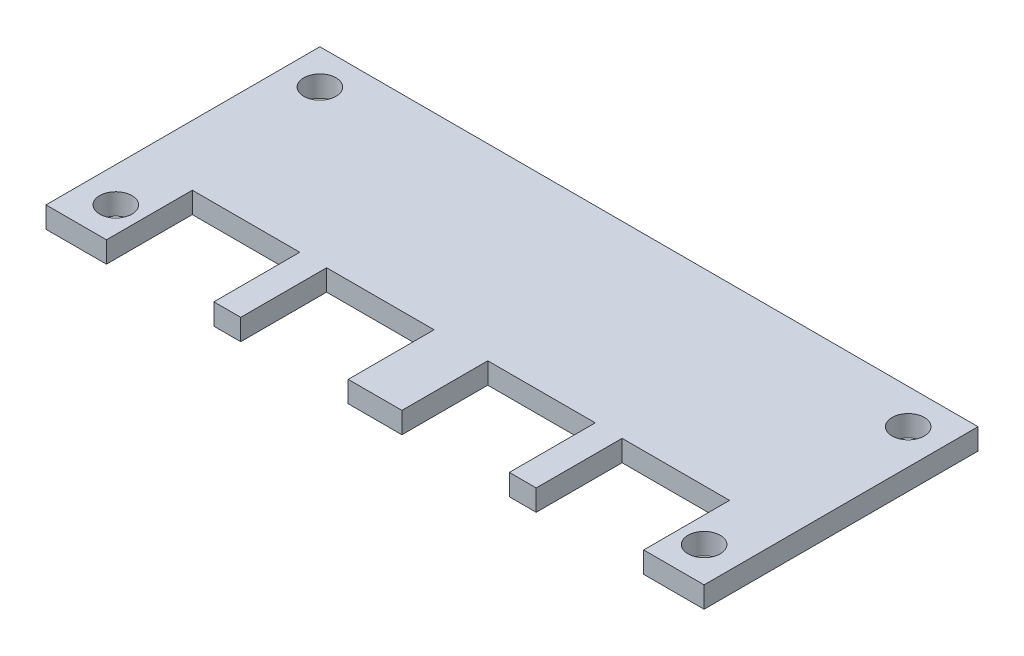
ISO-10303-21;
HEADER;
FILE_DESCRIPTION(('STEP AP214'),'2;1');
FILE_NAME('part.step','',(''),(''),'','','');
FILE_SCHEMA(('AUTOMOTIVE_DESIGN { 1 0 10303 214 1 1 1 1 }'));
ENDSEC;
DATA;
#1=APPLICATION_CONTEXT('core data for automotive mechanical design processes');
#2=APPLICATION_PROTOCOL_DEFINITION('international standard','automotive_design',2000,#1);
#3=PRODUCT_CONTEXT('',#1,'mechanical');
#4=PRODUCT('Part','Part','',(#3));
#5=PRODUCT_RELATED_PRODUCT_CATEGORY('part','',(#4));
#6=PRODUCT_DEFINITION_FORMATION('','',#4);
#7=PRODUCT_DEFINITION_CONTEXT('part definition',#1,'design');
#8=PRODUCT_DEFINITION('design','',#6,#7);
#9=PRODUCT_DEFINITION_SHAPE('','',#8);
#10=(LENGTH_UNIT() NAMED_UNIT(*) SI_UNIT(.MILLI.,.METRE.));
#11=(NAMED_UNIT(*) PLANE_ANGLE_UNIT() SI_UNIT($,.RADIAN.));
#12=(NAMED_UNIT(*) SI_UNIT($,.STERADIAN.) SOLID_ANGLE_UNIT());
#13=UNCERTAINTY_MEASURE_WITH_UNIT(LENGTH_MEASURE(1.E-05),#10,'distance_accuracy_value','');
#14=(GEOMETRIC_REPRESENTATION_CONTEXT(3) GLOBAL_UNCERTAINTY_ASSIGNED_CONTEXT((#13)) GLOBAL_UNIT_ASSIGNED_CONTEXT((#10,
#11,#12)) REPRESENTATION_CONTEXT('',''));
#15=CARTESIAN_POINT('',(0.,0.,0.));
#16=DIRECTION('',(0.,0.,1.));
#17=DIRECTION('',(1.,0.,0.));
#18=AXIS2_PLACEMENT_3D('',#15,#16,#17);
#19=CARTESIAN_POINT('',(0.,2.,0.));
#20=DIRECTION('',(0.,0.,-1.));
#21=DIRECTION('',(-1.,0.,0.));
#22=AXIS2_PLACEMENT_3D('',#19,#20,#21);
#23=PLANE('',#22);
#24=DIRECTION('',(1.,0.,0.));
#25=VECTOR('',#24,1.);
#26=CARTESIAN_POINT('',(0.,0.,0.));
#27=LINE('',#26,#25);
#28=CARTESIAN_POINT('',(28.575,0.,0.));
#29=VERTEX_POINT('',#28);
#30=CARTESIAN_POINT('',(33.655,0.,0.));
#31=VERTEX_POINT('',#30);
#32=EDGE_CURVE('E396',#29,#31,#27,.T.);
#33=ORIENTED_EDGE('',*,*,#32,.T.);
#34=DIRECTION('',(0.,1.,0.));
#35=VECTOR('',#34,1.);
#36=CARTESIAN_POINT('',(33.655,-8.,0.));
#37=LINE('',#36,#35);
#38=CARTESIAN_POINT('',(33.655,2.,0.));
#39=VERTEX_POINT('',#38);
#40=EDGE_CURVE('E293',#31,#39,#37,.T.);
#41=ORIENTED_EDGE('',*,*,#40,.T.);
#42=DIRECTION('',(1.,0.,0.));
#43=VECTOR('',#42,1.);
#44=CARTESIAN_POINT('',(0.,2.,0.));
#45=LINE('',#44,#43);
#46=CARTESIAN_POINT('',(28.575,2.,0.));
#47=VERTEX_POINT('',#46);
#48=EDGE_CURVE('E199',#47,#39,#45,.T.);
#49=ORIENTED_EDGE('',*,*,#48,.F.);
#50=DIRECTION('',(0.,1.,0.));
#51=VECTOR('',#50,1.);
#52=CARTESIAN_POINT('',(28.575,-8.,0.));
#53=LINE('',#52,#51);
#54=EDGE_CURVE('E189',#29,#47,#53,.T.);
#55=ORIENTED_EDGE('',*,*,#54,.F.);
#56=EDGE_LOOP('',(#33,#41,#49,#55));
#57=FACE_BOUND('',#56,.T.);
#58=ADVANCED_FACE('F33',(#57),#23,.F.);
#59=CARTESIAN_POINT('',(15.875,0.,0.));
#60=VERTEX_POINT('',#59);
#61=CARTESIAN_POINT('',(18.415,0.,0.));
#62=VERTEX_POINT('',#61);
#63=EDGE_CURVE('E188',#60,#62,#27,.T.);
#64=ORIENTED_EDGE('',*,*,#63,.T.);
#65=DIRECTION('',(0.,1.,0.));
#66=VECTOR('',#65,1.);
#67=CARTESIAN_POINT('',(18.415,-8.,0.));
#68=LINE('',#67,#66);
#69=CARTESIAN_POINT('',(18.415,2.,0.));
#70=VERTEX_POINT('',#69);
#71=EDGE_CURVE('E171',#62,#70,#68,.T.);
#72=ORIENTED_EDGE('',*,*,#71,.T.);
#73=CARTESIAN_POINT('',(15.875,2.,0.));
#74=VERTEX_POINT('',#73);
#75=EDGE_CURVE('E186',#74,#70,#45,.T.);
#76=ORIENTED_EDGE('',*,*,#75,.F.);
#77=DIRECTION('',(0.,1.,0.));
#78=VECTOR('',#77,1.);
#79=CARTESIAN_POINT('',(15.875,-8.,0.));
#80=LINE('',#79,#78);
#81=EDGE_CURVE('E374',#60,#74,#80,.T.);
#82=ORIENTED_EDGE('',*,*,#81,.F.);
#83=EDGE_LOOP('',(#64,#72,#76,#82));
#84=FACE_BOUND('',#83,.T.);
#85=ADVANCED_FACE('F184',(#84),#23,.F.);
#86=CARTESIAN_POINT('',(0.,0.,0.));
#87=VERTEX_POINT('',#86);
#88=CARTESIAN_POINT('',(5.715,0.,0.));
#89=VERTEX_POINT('',#88);
#90=EDGE_CURVE('E218',#87,#89,#27,.T.);
#91=ORIENTED_EDGE('',*,*,#90,.T.);
#92=DIRECTION('',(0.,1.,0.));
#93=VECTOR('',#92,1.);
#94=CARTESIAN_POINT('',(5.715,-8.,0.));
#95=LINE('',#94,#93);
#96=CARTESIAN_POINT('',(5.715,2.,0.));
#97=VERTEX_POINT('',#96);
#98=EDGE_CURVE('E353',#89,#97,#95,.T.);
#99=ORIENTED_EDGE('',*,*,#98,.T.);
#100=CARTESIAN_POINT('',(0.,2.,0.));
#101=VERTEX_POINT('',#100);
#102=EDGE_CURVE('E198',#101,#97,#45,.T.);
#103=ORIENTED_EDGE('',*,*,#102,.F.);
#104=DIRECTION('',(0.,-1.,0.));
#105=VECTOR('',#104,1.);
#106=CARTESIAN_POINT('',(0.,2.,0.));
#107=LINE('',#106,#105);
#108=EDGE_CURVE('E233',#101,#87,#107,.T.);
#109=ORIENTED_EDGE('',*,*,#108,.T.);
#110=EDGE_LOOP('',(#91,#99,#103,#109));
#111=FACE_BOUND('',#110,.T.);
#112=ADVANCED_FACE('F333',(#111),#23,.F.);
#113=CARTESIAN_POINT('',(43.815,2.,0.));
#114=VERTEX_POINT('',#113);
#115=CARTESIAN_POINT('',(46.355,2.,0.));
#116=VERTEX_POINT('',#115);
#117=EDGE_CURVE('E204',#114,#116,#45,.T.);
#118=ORIENTED_EDGE('',*,*,#117,.F.);
#119=DIRECTION('',(0.,1.,0.));
#120=VECTOR('',#119,1.);
#121=CARTESIAN_POINT('',(43.815,-8.,0.));
#122=LINE('',#121,#120);
#123=CARTESIAN_POINT('',(43.815,0.,0.));
#124=VERTEX_POINT('',#123);
#125=EDGE_CURVE('E286',#124,#114,#122,.T.);
#126=ORIENTED_EDGE('',*,*,#125,.F.);
#127=CARTESIAN_POINT('',(46.355,0.,0.));
#128=VERTEX_POINT('',#127);
#129=EDGE_CURVE('E283',#124,#128,#27,.T.);
#130=ORIENTED_EDGE('',*,*,#129,.T.);
#131=DIRECTION('',(0.,1.,0.));
#132=VECTOR('',#131,1.);
#133=CARTESIAN_POINT('',(46.355,-8.,0.));
#134=LINE('',#133,#132);
#135=EDGE_CURVE('E418',#128,#116,#134,.T.);
#136=ORIENTED_EDGE('',*,*,#135,.T.);
#137=EDGE_LOOP('',(#118,#126,#130,#136));
#138=FACE_BOUND('',#137,.T.);
#139=ADVANCED_FACE('F290',(#138),#23,.F.);
#140=CARTESIAN_POINT('',(0.,2.,0.));
#141=DIRECTION('',(1.,0.,0.));
#142=DIRECTION('',(0.,0.,-1.));
#143=AXIS2_PLACEMENT_3D('',#140,#141,#142);
#144=PLANE('',#143);
#145=DIRECTION('',(0.,0.,1.));
#146=VECTOR('',#145,1.);
#147=CARTESIAN_POINT('',(0.,0.,0.));
#148=LINE('',#147,#146);
#149=CARTESIAN_POINT('',(0.,0.,-25.9));
#150=VERTEX_POINT('',#149);
#151=EDGE_CURVE('E213',#150,#87,#148,.T.);
#152=ORIENTED_EDGE('',*,*,#151,.T.);
#153=ORIENTED_EDGE('',*,*,#108,.F.);
#154=DIRECTION('',(0.,0.,1.));
#155=VECTOR('',#154,1.);
#156=CARTESIAN_POINT('',(0.,2.,0.));
#157=LINE('',#156,#155);
#158=CARTESIAN_POINT('',(0.,2.,-25.9));
#159=VERTEX_POINT('',#158);
#160=EDGE_CURVE('E207',#159,#101,#157,.T.);
#161=ORIENTED_EDGE('',*,*,#160,.F.);
#162=DIRECTION('',(0.,-1.,0.));
#163=VECTOR('',#162,1.);
#164=CARTESIAN_POINT('',(0.,2.,-25.9));
#165=LINE('',#164,#163);
#166=EDGE_CURVE('E212',#159,#150,#165,.T.);
#167=ORIENTED_EDGE('',*,*,#166,.T.);
#168=EDGE_LOOP('',(#152,#153,#161,#167));
#169=FACE_BOUND('',#168,.T.);
#170=ADVANCED_FACE('F35',(#169),#144,.F.);
#171=CARTESIAN_POINT('',(56.515,2.,0.));
#172=VERTEX_POINT('',#171);
#173=CARTESIAN_POINT('',(62.23,2.,0.));
#174=VERTEX_POINT('',#173);
#175=EDGE_CURVE('E203',#172,#174,#45,.T.);
#176=ORIENTED_EDGE('',*,*,#175,.F.);
#177=DIRECTION('',(0.,1.,0.));
#178=VECTOR('',#177,1.);
#179=CARTESIAN_POINT('',(56.515,-8.,0.));
#180=LINE('',#179,#178);
#181=CARTESIAN_POINT('',(56.515,0.,0.));
#182=VERTEX_POINT('',#181);
#183=EDGE_CURVE('E403',#182,#172,#180,.T.);
#184=ORIENTED_EDGE('',*,*,#183,.F.);
#185=CARTESIAN_POINT('',(62.23,0.,0.));
#186=VERTEX_POINT('',#185);
#187=EDGE_CURVE('E216',#182,#186,#27,.T.);
#188=ORIENTED_EDGE('',*,*,#187,.T.);
#189=DIRECTION('',(0.,-1.,0.));
#190=VECTOR('',#189,1.);
#191=CARTESIAN_POINT('',(62.23,2.,0.));
#192=LINE('',#191,#190);
#193=EDGE_CURVE('E230',#174,#186,#192,.T.);
#194=ORIENTED_EDGE('',*,*,#193,.F.);
#195=EDGE_LOOP('',(#176,#184,#188,#194));
#196=FACE_BOUND('',#195,.T.);
#197=ADVANCED_FACE('F329',(#196),#23,.F.);
#198=CARTESIAN_POINT('',(62.23,2.,0.));
#199=DIRECTION('',(-1.,0.,0.));
#200=DIRECTION('',(0.,0.,1.));
#201=AXIS2_PLACEMENT_3D('',#198,#199,#200);
#202=PLANE('',#201);
#203=DIRECTION('',(0.,0.,-1.));
#204=VECTOR('',#203,1.);
#205=CARTESIAN_POINT('',(62.23,0.,0.));
#206=LINE('',#205,#204);
#207=CARTESIAN_POINT('',(62.23,0.,-25.9));
#208=VERTEX_POINT('',#207);
#209=EDGE_CURVE('E221',#186,#208,#206,.T.);
#210=ORIENTED_EDGE('',*,*,#209,.T.);
#211=DIRECTION('',(0.,-1.,0.));
#212=VECTOR('',#211,1.);
#213=CARTESIAN_POINT('',(62.23,2.,-25.9));
#214=LINE('',#213,#212);
#215=CARTESIAN_POINT('',(62.23,2.,-25.9));
#216=VERTEX_POINT('',#215);
#217=EDGE_CURVE('E227',#216,#208,#214,.T.);
#218=ORIENTED_EDGE('',*,*,#217,.F.);
#219=DIRECTION('',(0.,0.,-1.));
#220=VECTOR('',#219,1.);
#221=CARTESIAN_POINT('',(62.23,2.,0.));
#222=LINE('',#221,#220);
#223=EDGE_CURVE('E202',#174,#216,#222,.T.);
#224=ORIENTED_EDGE('',*,*,#223,.F.);
#225=ORIENTED_EDGE('',*,*,#193,.T.);
#226=EDGE_LOOP('',(#210,#218,#224,#225));
#227=FACE_BOUND('',#226,.T.);
#228=ADVANCED_FACE('F321',(#227),#202,.F.);
#229=CARTESIAN_POINT('',(0.,2.,-25.9));
#230=DIRECTION('',(0.,0.,1.));
#231=DIRECTION('',(1.,0.,0.));
#232=AXIS2_PLACEMENT_3D('',#229,#230,#231);
#233=PLANE('',#232);
#234=DIRECTION('',(-1.,0.,0.));
#235=VECTOR('',#234,1.);
#236=CARTESIAN_POINT('',(0.,0.,-25.9));
#237=LINE('',#236,#235);
#238=EDGE_CURVE('E223',#208,#150,#237,.T.);
#239=ORIENTED_EDGE('',*,*,#238,.T.);
#240=ORIENTED_EDGE('',*,*,#166,.F.);
#241=DIRECTION('',(-1.,0.,0.));
#242=VECTOR('',#241,1.);
#243=CARTESIAN_POINT('',(0.,2.,-25.9));
#244=LINE('',#243,#242);
#245=EDGE_CURVE('E210',#216,#159,#244,.T.);
#246=ORIENTED_EDGE('',*,*,#245,.F.);
#247=ORIENTED_EDGE('',*,*,#217,.T.);
#248=EDGE_LOOP('',(#239,#240,#246,#247));
#249=FACE_BOUND('',#248,.T.);
#250=ADVANCED_FACE('F313',(#249),#233,.F.);
#251=CARTESIAN_POINT('',(0.,2.,0.));
#252=DIRECTION('',(0.,-1.,0.));
#253=DIRECTION('',(0.,0.,-1.));
#254=AXIS2_PLACEMENT_3D('',#251,#252,#253);
#255=PLANE('',#254);
#256=CARTESIAN_POINT('',(58.93,2.,-22.6));
#257=DIRECTION('',(0.,1.,0.));
#258=DIRECTION('',(0.,0.,-1.));
#259=AXIS2_PLACEMENT_3D('',#256,#257,#258);
#260=CIRCLE('',#259,1.52399999999999);
#261=CARTESIAN_POINT('',(58.93,2.,-24.124));
#262=VERTEX_POINT('',#261);
#263=EDGE_CURVE('E306',#262,#262,#260,.T.);
#264=ORIENTED_EDGE('',*,*,#263,.F.);
#265=EDGE_LOOP('',(#264));
#266=FACE_BOUND('',#265,.T.);
#267=CARTESIAN_POINT('',(58.93,2.,-3.30000000000001));
#268=DIRECTION('',(0.,1.,0.));
#269=DIRECTION('',(0.,0.,1.));
#270=AXIS2_PLACEMENT_3D('',#267,#268,#269);
#271=CIRCLE('',#270,1.52400000000001);
#272=CARTESIAN_POINT('',(58.93,2.,-1.77600000000001));
#273=VERTEX_POINT('',#272);
#274=EDGE_CURVE('E304',#273,#273,#271,.T.);
#275=ORIENTED_EDGE('',*,*,#274,.F.);
#276=EDGE_LOOP('',(#275));
#277=FACE_BOUND('',#276,.T.);
#278=CARTESIAN_POINT('',(3.3,2.,-3.30000000000001));
#279=DIRECTION('',(0.,1.,0.));
#280=DIRECTION('',(0.,0.,-1.));
#281=AXIS2_PLACEMENT_3D('',#278,#279,#280);
#282=CIRCLE('',#281,1.524);
#283=CARTESIAN_POINT('',(3.3,2.,-4.82400000000001));
#284=VERTEX_POINT('',#283);
#285=EDGE_CURVE('E301',#284,#284,#282,.T.);
#286=ORIENTED_EDGE('',*,*,#285,.F.);
#287=EDGE_LOOP('',(#286));
#288=FACE_BOUND('',#287,.T.);
#289=CARTESIAN_POINT('',(3.3,2.,-22.6));
#290=DIRECTION('',(0.,1.,0.));
#291=DIRECTION('',(0.,0.,1.));
#292=AXIS2_PLACEMENT_3D('',#289,#290,#291);
#293=CIRCLE('',#292,1.524);
#294=CARTESIAN_POINT('',(3.3,2.,-21.076));
#295=VERTEX_POINT('',#294);
#296=EDGE_CURVE('E241',#295,#295,#293,.T.);
#297=ORIENTED_EDGE('',*,*,#296,.F.);
#298=EDGE_LOOP('',(#297));
#299=FACE_BOUND('',#298,.T.);
#300=ORIENTED_EDGE('',*,*,#48,.T.);
#301=DIRECTION('',(0.,0.,1.));
#302=VECTOR('',#301,1.);
#303=CARTESIAN_POINT('',(33.655,2.,-8.12000000000001));
#304=LINE('',#303,#302);
#305=CARTESIAN_POINT('',(33.655,2.,-8.12000000000001));
#306=VERTEX_POINT('',#305);
#307=EDGE_CURVE('E383',#306,#39,#304,.T.);
#308=ORIENTED_EDGE('',*,*,#307,.F.);
#309=DIRECTION('',(-1.,0.,0.));
#310=VECTOR('',#309,1.);
#311=CARTESIAN_POINT('',(43.815,2.,-8.12000000000001));
#312=LINE('',#311,#310);
#313=CARTESIAN_POINT('',(43.815,2.,-8.12000000000001));
#314=VERTEX_POINT('',#313);
#315=EDGE_CURVE('E297',#314,#306,#312,.T.);
#316=ORIENTED_EDGE('',*,*,#315,.F.);
#317=DIRECTION('',(0.,0.,-1.));
#318=VECTOR('',#317,1.);
#319=CARTESIAN_POINT('',(43.815,2.,-8.12000000000001));
#320=LINE('',#319,#318);
#321=EDGE_CURVE('E385',#114,#314,#320,.T.);
#322=ORIENTED_EDGE('',*,*,#321,.F.);
#323=ORIENTED_EDGE('',*,*,#117,.T.);
#324=DIRECTION('',(0.,0.,1.));
#325=VECTOR('',#324,1.);
#326=CARTESIAN_POINT('',(46.355,2.,0.));
#327=LINE('',#326,#325);
#328=CARTESIAN_POINT('',(46.355,2.,-8.12));
#329=VERTEX_POINT('',#328);
#330=EDGE_CURVE('E369',#329,#116,#327,.T.);
#331=ORIENTED_EDGE('',*,*,#330,.F.);
#332=DIRECTION('',(-1.,0.,0.));
#333=VECTOR('',#332,1.);
#334=CARTESIAN_POINT('',(56.515,2.,-8.12));
#335=LINE('',#334,#333);
#336=CARTESIAN_POINT('',(56.515,2.,-8.12));
#337=VERTEX_POINT('',#336);
#338=EDGE_CURVE('E415',#337,#329,#335,.T.);
#339=ORIENTED_EDGE('',*,*,#338,.F.);
#340=DIRECTION('',(0.,0.,-1.));
#341=VECTOR('',#340,1.);
#342=CARTESIAN_POINT('',(56.515,2.,0.));
#343=LINE('',#342,#341);
#344=EDGE_CURVE('E372',#172,#337,#343,.T.);
#345=ORIENTED_EDGE('',*,*,#344,.F.);
#346=ORIENTED_EDGE('',*,*,#175,.T.);
#347=ORIENTED_EDGE('',*,*,#223,.T.);
#348=ORIENTED_EDGE('',*,*,#245,.T.);
#349=ORIENTED_EDGE('',*,*,#160,.T.);
#350=ORIENTED_EDGE('',*,*,#102,.T.);
#351=DIRECTION('',(0.,0.,1.));
#352=VECTOR('',#351,1.);
#353=CARTESIAN_POINT('',(5.715,2.,0.));
#354=LINE('',#353,#352);
#355=CARTESIAN_POINT('',(5.715,2.,-8.12));
#356=VERTEX_POINT('',#355);
#357=EDGE_CURVE('E426',#356,#97,#354,.T.);
#358=ORIENTED_EDGE('',*,*,#357,.F.);
#359=DIRECTION('',(-1.,0.,0.));
#360=VECTOR('',#359,1.);
#361=CARTESIAN_POINT('',(5.715,2.,-8.12));
#362=LINE('',#361,#360);
#363=CARTESIAN_POINT('',(15.875,2.,-8.12));
#364=VERTEX_POINT('',#363);
#365=EDGE_CURVE('E367',#364,#356,#362,.T.);
#366=ORIENTED_EDGE('',*,*,#365,.F.);
#367=DIRECTION('',(0.,0.,-1.));
#368=VECTOR('',#367,1.);
#369=CARTESIAN_POINT('',(15.875,2.,0.));
#370=LINE('',#369,#368);
#371=EDGE_CURVE('E197',#74,#364,#370,.T.);
#372=ORIENTED_EDGE('',*,*,#371,.F.);
#373=ORIENTED_EDGE('',*,*,#75,.T.);
#374=DIRECTION('',(0.,0.,1.));
#375=VECTOR('',#374,1.);
#376=CARTESIAN_POINT('',(18.415,2.,-8.12000000000001));
#377=LINE('',#376,#375);
#378=CARTESIAN_POINT('',(18.415,2.,-8.12000000000001));
#379=VERTEX_POINT('',#378);
#380=EDGE_CURVE('E168',#379,#70,#377,.T.);
#381=ORIENTED_EDGE('',*,*,#380,.F.);
#382=DIRECTION('',(-1.,0.,0.));
#383=VECTOR('',#382,1.);
#384=CARTESIAN_POINT('',(18.415,2.,-8.12000000000001));
#385=LINE('',#384,#383);
#386=CARTESIAN_POINT('',(28.575,2.,-8.12000000000001));
#387=VERTEX_POINT('',#386);
#388=EDGE_CURVE('E190',#387,#379,#385,.T.);
#389=ORIENTED_EDGE('',*,*,#388,.F.);
#390=DIRECTION('',(0.,0.,-1.));
#391=VECTOR('',#390,1.);
#392=CARTESIAN_POINT('',(28.575,2.,-8.12000000000001));
#393=LINE('',#392,#391);
#394=EDGE_CURVE('E179',#47,#387,#393,.T.);
#395=ORIENTED_EDGE('',*,*,#394,.F.);
#396=EDGE_LOOP('',(#300,#308,#316,#322,#323,#331,#339,#345,#346,#347,#348,#349,#350,#358,#366,
#372,#373,#381,#389,#395));
#397=FACE_BOUND('',#396,.T.);
#398=ADVANCED_FACE('F194',(#266,#277,#288,#299,#397),#255,.F.);
#399=CARTESIAN_POINT('',(0.,0.,0.));
#400=DIRECTION('',(0.,-1.,0.));
#401=DIRECTION('',(0.,0.,-1.));
#402=AXIS2_PLACEMENT_3D('',#399,#400,#401);
#403=PLANE('',#402);
#404=DIRECTION('',(0.,0.,-1.));
#405=VECTOR('',#404,1.);
#406=CARTESIAN_POINT('',(33.655,0.,0.));
#407=LINE('',#406,#405);
#408=CARTESIAN_POINT('',(33.655,0.,-8.12000000000001));
#409=VERTEX_POINT('',#408);
#410=EDGE_CURVE('E11',#31,#409,#407,.T.);
#411=ORIENTED_EDGE('',*,*,#410,.F.);
#412=ORIENTED_EDGE('',*,*,#32,.F.);
#413=DIRECTION('',(0.,0.,1.));
#414=VECTOR('',#413,1.);
#415=CARTESIAN_POINT('',(28.575,0.,0.));
#416=LINE('',#415,#414);
#417=CARTESIAN_POINT('',(28.575,0.,-8.12000000000001));
#418=VERTEX_POINT('',#417);
#419=EDGE_CURVE('E255',#418,#29,#416,.T.);
#420=ORIENTED_EDGE('',*,*,#419,.F.);
#421=DIRECTION('',(1.,0.,0.));
#422=VECTOR('',#421,1.);
#423=CARTESIAN_POINT('',(0.,0.,-8.12000000000001));
#424=LINE('',#423,#422);
#425=CARTESIAN_POINT('',(18.415,0.,-8.12000000000001));
#426=VERTEX_POINT('',#425);
#427=EDGE_CURVE('E257',#426,#418,#424,.T.);
#428=ORIENTED_EDGE('',*,*,#427,.F.);
#429=DIRECTION('',(0.,0.,-1.));
#430=VECTOR('',#429,1.);
#431=CARTESIAN_POINT('',(18.415,0.,0.));
#432=LINE('',#431,#430);
#433=EDGE_CURVE('E259',#62,#426,#432,.T.);
#434=ORIENTED_EDGE('',*,*,#433,.F.);
#435=ORIENTED_EDGE('',*,*,#63,.F.);
#436=DIRECTION('',(0.,0.,1.));
#437=VECTOR('',#436,1.);
#438=CARTESIAN_POINT('',(15.875,0.,0.));
#439=LINE('',#438,#437);
#440=CARTESIAN_POINT('',(15.875,0.,-8.12));
#441=VERTEX_POINT('',#440);
#442=EDGE_CURVE('E248',#441,#60,#439,.T.);
#443=ORIENTED_EDGE('',*,*,#442,.F.);
#444=DIRECTION('',(1.,0.,0.));
#445=VECTOR('',#444,1.);
#446=CARTESIAN_POINT('',(0.,0.,-8.12));
#447=LINE('',#446,#445);
#448=CARTESIAN_POINT('',(5.715,0.,-8.12));
#449=VERTEX_POINT('',#448);
#450=EDGE_CURVE('E250',#449,#441,#447,.T.);
#451=ORIENTED_EDGE('',*,*,#450,.F.);
#452=DIRECTION('',(0.,0.,-1.));
#453=VECTOR('',#452,1.);
#454=CARTESIAN_POINT('',(5.715,0.,0.));
#455=LINE('',#454,#453);
#456=EDGE_CURVE('E253',#89,#449,#455,.T.);
#457=ORIENTED_EDGE('',*,*,#456,.F.);
#458=ORIENTED_EDGE('',*,*,#90,.F.);
#459=ORIENTED_EDGE('',*,*,#151,.F.);
#460=ORIENTED_EDGE('',*,*,#238,.F.);
#461=ORIENTED_EDGE('',*,*,#209,.F.);
#462=ORIENTED_EDGE('',*,*,#187,.F.);
#463=DIRECTION('',(0.,0.,1.));
#464=VECTOR('',#463,1.);
#465=CARTESIAN_POINT('',(56.515,0.,0.));
#466=LINE('',#465,#464);
#467=CARTESIAN_POINT('',(56.515,0.,-8.12));
#468=VERTEX_POINT('',#467);
#469=EDGE_CURVE('E236',#468,#182,#466,.T.);
#470=ORIENTED_EDGE('',*,*,#469,.F.);
#471=DIRECTION('',(1.,0.,0.));
#472=VECTOR('',#471,1.);
#473=CARTESIAN_POINT('',(0.,0.,-8.11999999999998));
#474=LINE('',#473,#472);
#475=CARTESIAN_POINT('',(46.355,0.,-8.12));
#476=VERTEX_POINT('',#475);
#477=EDGE_CURVE('E243',#476,#468,#474,.T.);
#478=ORIENTED_EDGE('',*,*,#477,.F.);
#479=DIRECTION('',(0.,0.,-1.));
#480=VECTOR('',#479,1.);
#481=CARTESIAN_POINT('',(46.355,0.,0.));
#482=LINE('',#481,#480);
#483=EDGE_CURVE('E246',#128,#476,#482,.T.);
#484=ORIENTED_EDGE('',*,*,#483,.F.);
#485=ORIENTED_EDGE('',*,*,#129,.F.);
#486=DIRECTION('',(0.,0.,1.));
#487=VECTOR('',#486,1.);
#488=CARTESIAN_POINT('',(43.815,0.,0.));
#489=LINE('',#488,#487);
#490=CARTESIAN_POINT('',(43.815,0.,-8.12000000000001));
#491=VERTEX_POINT('',#490);
#492=EDGE_CURVE('E261',#491,#124,#489,.T.);
#493=ORIENTED_EDGE('',*,*,#492,.F.);
#494=DIRECTION('',(1.,0.,0.));
#495=VECTOR('',#494,1.);
#496=CARTESIAN_POINT('',(0.,0.,-8.12000000000002));
#497=LINE('',#496,#495);
#498=EDGE_CURVE('E41',#409,#491,#497,.T.);
#499=ORIENTED_EDGE('',*,*,#498,.F.);
#500=EDGE_LOOP('',(#411,#412,#420,#428,#434,#435,#443,#451,#457,#458,#459,#460,#461,#462,#470,
#478,#484,#485,#493,#499));
#501=FACE_BOUND('',#500,.T.);
#502=CARTESIAN_POINT('',(58.93,0.,-22.6));
#503=DIRECTION('',(0.,-1.,0.));
#504=DIRECTION('',(0.,0.,-1.));
#505=AXIS2_PLACEMENT_3D('',#502,#503,#504);
#506=CIRCLE('',#505,1.52399999999999);
#507=CARTESIAN_POINT('',(58.93,0.,-24.124));
#508=VERTEX_POINT('',#507);
#509=EDGE_CURVE('E217',#508,#508,#506,.T.);
#510=ORIENTED_EDGE('',*,*,#509,.F.);
#511=EDGE_LOOP('',(#510));
#512=FACE_BOUND('',#511,.T.);
#513=CARTESIAN_POINT('',(58.93,0.,-3.30000000000001));
#514=DIRECTION('',(0.,-1.,0.));
#515=DIRECTION('',(0.,0.,-1.));
#516=AXIS2_PLACEMENT_3D('',#513,#514,#515);
#517=CIRCLE('',#516,1.52400000000001);
#518=CARTESIAN_POINT('',(58.93,0.,-4.82400000000002));
#519=VERTEX_POINT('',#518);
#520=EDGE_CURVE('E264',#519,#519,#517,.T.);
#521=ORIENTED_EDGE('',*,*,#520,.F.);
#522=EDGE_LOOP('',(#521));
#523=FACE_BOUND('',#522,.T.);
#524=CARTESIAN_POINT('',(3.3,0.,-3.30000000000001));
#525=DIRECTION('',(0.,-1.,0.));
#526=DIRECTION('',(0.,0.,-1.));
#527=AXIS2_PLACEMENT_3D('',#524,#525,#526);
#528=CIRCLE('',#527,1.524);
#529=CARTESIAN_POINT('',(3.3,0.,-4.82400000000001));
#530=VERTEX_POINT('',#529);
#531=EDGE_CURVE('E240',#530,#530,#528,.T.);
#532=ORIENTED_EDGE('',*,*,#531,.F.);
#533=EDGE_LOOP('',(#532));
#534=FACE_BOUND('',#533,.T.);
#535=CARTESIAN_POINT('',(3.3,0.,-22.6));
#536=DIRECTION('',(0.,-1.,0.));
#537=DIRECTION('',(0.,0.,-1.));
#538=AXIS2_PLACEMENT_3D('',#535,#536,#537);
#539=CIRCLE('',#538,1.524);
#540=CARTESIAN_POINT('',(3.3,0.,-24.124));
#541=VERTEX_POINT('',#540);
#542=EDGE_CURVE('E237',#541,#541,#539,.T.);
#543=ORIENTED_EDGE('',*,*,#542,.F.);
#544=EDGE_LOOP('',(#543));
#545=FACE_BOUND('',#544,.T.);
#546=ADVANCED_FACE('F279',(#501,#512,#523,#534,#545),#403,.T.);
#547=CARTESIAN_POINT('',(3.3,-8.,-22.6));
#548=DIRECTION('',(0.,1.,0.));
#549=DIRECTION('',(0.,0.,1.));
#550=AXIS2_PLACEMENT_3D('',#547,#548,#549);
#551=CYLINDRICAL_SURFACE('',#550,1.524);
#552=ORIENTED_EDGE('',*,*,#542,.T.);
#553=EDGE_LOOP('',(#552));
#554=FACE_BOUND('',#553,.T.);
#555=ORIENTED_EDGE('',*,*,#296,.T.);
#556=EDGE_LOOP('',(#555));
#557=FACE_BOUND('',#556,.T.);
#558=ADVANCED_FACE('F310',(#554,#557),#551,.F.);
#559=CARTESIAN_POINT('',(46.355,-8.,0.));
#560=DIRECTION('',(-1.,0.,0.));
#561=DIRECTION('',(0.,0.,1.));
#562=AXIS2_PLACEMENT_3D('',#559,#560,#561);
#563=PLANE('',#562);
#564=ORIENTED_EDGE('',*,*,#483,.T.);
#565=DIRECTION('',(0.,1.,0.));
#566=VECTOR('',#565,1.);
#567=CARTESIAN_POINT('',(46.355,-8.,-8.12));
#568=LINE('',#567,#566);
#569=EDGE_CURVE('E386',#476,#329,#568,.T.);
#570=ORIENTED_EDGE('',*,*,#569,.T.);
#571=ORIENTED_EDGE('',*,*,#330,.T.);
#572=ORIENTED_EDGE('',*,*,#135,.F.);
#573=EDGE_LOOP('',(#564,#570,#571,#572));
#574=FACE_BOUND('',#573,.T.);
#575=ADVANCED_FACE('F417',(#574),#563,.F.);
#576=CARTESIAN_POINT('',(56.515,-8.,-8.12));
#577=DIRECTION('',(0.,0.,-1.));
#578=DIRECTION('',(-1.,0.,0.));
#579=AXIS2_PLACEMENT_3D('',#576,#577,#578);
#580=PLANE('',#579);
#581=ORIENTED_EDGE('',*,*,#477,.T.);
#582=DIRECTION('',(0.,1.,0.));
#583=VECTOR('',#582,1.);
#584=CARTESIAN_POINT('',(56.515,-8.,-8.12));
#585=LINE('',#584,#583);
#586=EDGE_CURVE('E421',#468,#337,#585,.T.);
#587=ORIENTED_EDGE('',*,*,#586,.T.);
#588=ORIENTED_EDGE('',*,*,#338,.T.);
#589=ORIENTED_EDGE('',*,*,#569,.F.);
#590=EDGE_LOOP('',(#581,#587,#588,#589));
#591=FACE_BOUND('',#590,.T.);
#592=ADVANCED_FACE('F440',(#591),#580,.F.);
#593=CARTESIAN_POINT('',(56.515,-8.,0.));
#594=DIRECTION('',(1.,0.,0.));
#595=DIRECTION('',(0.,0.,-1.));
#596=AXIS2_PLACEMENT_3D('',#593,#594,#595);
#597=PLANE('',#596);
#598=ORIENTED_EDGE('',*,*,#469,.T.);
#599=ORIENTED_EDGE('',*,*,#183,.T.);
#600=ORIENTED_EDGE('',*,*,#344,.T.);
#601=ORIENTED_EDGE('',*,*,#586,.F.);
#602=EDGE_LOOP('',(#598,#599,#600,#601));
#603=FACE_BOUND('',#602,.T.);
#604=ADVANCED_FACE('F443',(#603),#597,.F.);
#605=CARTESIAN_POINT('',(5.715,-8.,0.));
#606=DIRECTION('',(-1.,0.,0.));
#607=DIRECTION('',(0.,0.,1.));
#608=AXIS2_PLACEMENT_3D('',#605,#606,#607);
#609=PLANE('',#608);
#610=ORIENTED_EDGE('',*,*,#456,.T.);
#611=DIRECTION('',(0.,1.,0.));
#612=VECTOR('',#611,1.);
#613=CARTESIAN_POINT('',(5.715,-8.,-8.12));
#614=LINE('',#613,#612);
#615=EDGE_CURVE('E363',#449,#356,#614,.T.);
#616=ORIENTED_EDGE('',*,*,#615,.T.);
#617=ORIENTED_EDGE('',*,*,#357,.T.);
#618=ORIENTED_EDGE('',*,*,#98,.F.);
#619=EDGE_LOOP('',(#610,#616,#617,#618));
#620=FACE_BOUND('',#619,.T.);
#621=ADVANCED_FACE('F362',(#620),#609,.F.);
#622=CARTESIAN_POINT('',(5.715,-8.,-8.12));
#623=DIRECTION('',(0.,0.,-1.));
#624=DIRECTION('',(-1.,0.,0.));
#625=AXIS2_PLACEMENT_3D('',#622,#623,#624);
#626=PLANE('',#625);
#627=ORIENTED_EDGE('',*,*,#450,.T.);
#628=DIRECTION('',(0.,1.,0.));
#629=VECTOR('',#628,1.);
#630=CARTESIAN_POINT('',(15.875,-8.,-8.12));
#631=LINE('',#630,#629);
#632=EDGE_CURVE('E370',#441,#364,#631,.T.);
#633=ORIENTED_EDGE('',*,*,#632,.T.);
#634=ORIENTED_EDGE('',*,*,#365,.T.);
#635=ORIENTED_EDGE('',*,*,#615,.F.);
#636=EDGE_LOOP('',(#627,#633,#634,#635));
#637=FACE_BOUND('',#636,.T.);
#638=ADVANCED_FACE('F366',(#637),#626,.F.);
#639=CARTESIAN_POINT('',(15.875,-8.,0.));
#640=DIRECTION('',(1.,0.,0.));
#641=DIRECTION('',(0.,0.,-1.));
#642=AXIS2_PLACEMENT_3D('',#639,#640,#641);
#643=PLANE('',#642);
#644=ORIENTED_EDGE('',*,*,#442,.T.);
#645=ORIENTED_EDGE('',*,*,#81,.T.);
#646=ORIENTED_EDGE('',*,*,#371,.T.);
#647=ORIENTED_EDGE('',*,*,#632,.F.);
#648=EDGE_LOOP('',(#644,#645,#646,#647));
#649=FACE_BOUND('',#648,.T.);
#650=ADVANCED_FACE('F428',(#649),#643,.F.);
#651=CARTESIAN_POINT('',(18.415,-8.,-8.12000000000001));
#652=DIRECTION('',(-1.,0.,0.));
#653=DIRECTION('',(0.,0.,1.));
#654=AXIS2_PLACEMENT_3D('',#651,#652,#653);
#655=PLANE('',#654);
#656=ORIENTED_EDGE('',*,*,#433,.T.);
#657=DIRECTION('',(0.,1.,0.));
#658=VECTOR('',#657,1.);
#659=CARTESIAN_POINT('',(18.415,-8.,-8.12000000000001));
#660=LINE('',#659,#658);
#661=EDGE_CURVE('E174',#426,#379,#660,.T.);
#662=ORIENTED_EDGE('',*,*,#661,.T.);
#663=ORIENTED_EDGE('',*,*,#380,.T.);
#664=ORIENTED_EDGE('',*,*,#71,.F.);
#665=EDGE_LOOP('',(#656,#662,#663,#664));
#666=FACE_BOUND('',#665,.T.);
#667=ADVANCED_FACE('F170',(#666),#655,.F.);
#668=CARTESIAN_POINT('',(18.415,-8.,-8.12000000000001));
#669=DIRECTION('',(0.,0.,-1.));
#670=DIRECTION('',(-1.,0.,0.));
#671=AXIS2_PLACEMENT_3D('',#668,#669,#670);
#672=PLANE('',#671);
#673=ORIENTED_EDGE('',*,*,#427,.T.);
#674=DIRECTION('',(0.,1.,0.));
#675=VECTOR('',#674,1.);
#676=CARTESIAN_POINT('',(28.575,-8.,-8.12000000000001));
#677=LINE('',#676,#675);
#678=EDGE_CURVE('E56',#418,#387,#677,.T.);
#679=ORIENTED_EDGE('',*,*,#678,.T.);
#680=ORIENTED_EDGE('',*,*,#388,.T.);
#681=ORIENTED_EDGE('',*,*,#661,.F.);
#682=EDGE_LOOP('',(#673,#679,#680,#681));
#683=FACE_BOUND('',#682,.T.);
#684=ADVANCED_FACE('F430',(#683),#672,.F.);
#685=CARTESIAN_POINT('',(28.575,-8.,-8.12000000000001));
#686=DIRECTION('',(1.,0.,0.));
#687=DIRECTION('',(0.,0.,-1.));
#688=AXIS2_PLACEMENT_3D('',#685,#686,#687);
#689=PLANE('',#688);
#690=ORIENTED_EDGE('',*,*,#419,.T.);
#691=ORIENTED_EDGE('',*,*,#54,.T.);
#692=ORIENTED_EDGE('',*,*,#394,.T.);
#693=ORIENTED_EDGE('',*,*,#678,.F.);
#694=EDGE_LOOP('',(#690,#691,#692,#693));
#695=FACE_BOUND('',#694,.T.);
#696=ADVANCED_FACE('F474',(#695),#689,.F.);
#697=CARTESIAN_POINT('',(3.3,-8.,-3.30000000000001));
#698=DIRECTION('',(0.,1.,0.));
#699=DIRECTION('',(0.,0.,1.));
#700=AXIS2_PLACEMENT_3D('',#697,#698,#699);
#701=CYLINDRICAL_SURFACE('',#700,1.524);
#702=ORIENTED_EDGE('',*,*,#531,.T.);
#703=EDGE_LOOP('',(#702));
#704=FACE_BOUND('',#703,.T.);
#705=ORIENTED_EDGE('',*,*,#285,.T.);
#706=EDGE_LOOP('',(#705));
#707=FACE_BOUND('',#706,.T.);
#708=ADVANCED_FACE('F471',(#704,#707),#701,.F.);
#709=CARTESIAN_POINT('',(58.93,-8.,-3.30000000000001));
#710=DIRECTION('',(0.,1.,0.));
#711=DIRECTION('',(0.,0.,1.));
#712=AXIS2_PLACEMENT_3D('',#709,#710,#711);
#713=CYLINDRICAL_SURFACE('',#712,1.52400000000001);
#714=ORIENTED_EDGE('',*,*,#520,.T.);
#715=EDGE_LOOP('',(#714));
#716=FACE_BOUND('',#715,.T.);
#717=ORIENTED_EDGE('',*,*,#274,.T.);
#718=EDGE_LOOP('',(#717));
#719=FACE_BOUND('',#718,.T.);
#720=ADVANCED_FACE('F463',(#716,#719),#713,.F.);
#721=CARTESIAN_POINT('',(58.93,-8.,-22.6));
#722=DIRECTION('',(0.,1.,0.));
#723=DIRECTION('',(0.,0.,1.));
#724=AXIS2_PLACEMENT_3D('',#721,#722,#723);
#725=CYLINDRICAL_SURFACE('',#724,1.52399999999999);
#726=ORIENTED_EDGE('',*,*,#509,.T.);
#727=EDGE_LOOP('',(#726));
#728=FACE_BOUND('',#727,.T.);
#729=ORIENTED_EDGE('',*,*,#263,.T.);
#730=EDGE_LOOP('',(#729));
#731=FACE_BOUND('',#730,.T.);
#732=ADVANCED_FACE('F460',(#728,#731),#725,.F.);
#733=CARTESIAN_POINT('',(33.655,-8.,-8.12000000000001));
#734=DIRECTION('',(-1.,0.,0.));
#735=DIRECTION('',(0.,0.,1.));
#736=AXIS2_PLACEMENT_3D('',#733,#734,#735);
#737=PLANE('',#736);
#738=ORIENTED_EDGE('',*,*,#410,.T.);
#739=DIRECTION('',(0.,1.,0.));
#740=VECTOR('',#739,1.);
#741=CARTESIAN_POINT('',(33.655,-8.,-8.12000000000001));
#742=LINE('',#741,#740);
#743=EDGE_CURVE('E275',#409,#306,#742,.T.);
#744=ORIENTED_EDGE('',*,*,#743,.T.);
#745=ORIENTED_EDGE('',*,*,#307,.T.);
#746=ORIENTED_EDGE('',*,*,#40,.F.);
#747=EDGE_LOOP('',(#738,#744,#745,#746));
#748=FACE_BOUND('',#747,.T.);
#749=ADVANCED_FACE('F389',(#748),#737,.F.);
#750=CARTESIAN_POINT('',(43.815,-8.,-8.12000000000001));
#751=DIRECTION('',(0.,0.,-1.));
#752=DIRECTION('',(-1.,0.,0.));
#753=AXIS2_PLACEMENT_3D('',#750,#751,#752);
#754=PLANE('',#753);
#755=ORIENTED_EDGE('',*,*,#498,.T.);
#756=DIRECTION('',(0.,1.,0.));
#757=VECTOR('',#756,1.);
#758=CARTESIAN_POINT('',(43.815,-8.,-8.12000000000001));
#759=LINE('',#758,#757);
#760=EDGE_CURVE('E48',#491,#314,#759,.T.);
#761=ORIENTED_EDGE('',*,*,#760,.T.);
#762=ORIENTED_EDGE('',*,*,#315,.T.);
#763=ORIENTED_EDGE('',*,*,#743,.F.);
#764=EDGE_LOOP('',(#755,#761,#762,#763));
#765=FACE_BOUND('',#764,.T.);
#766=ADVANCED_FACE('F273',(#765),#754,.F.);
#767=CARTESIAN_POINT('',(43.815,-8.,-8.12000000000001));
#768=DIRECTION('',(1.,0.,0.));
#769=DIRECTION('',(0.,0.,-1.));
#770=AXIS2_PLACEMENT_3D('',#767,#768,#769);
#771=PLANE('',#770);
#772=ORIENTED_EDGE('',*,*,#492,.T.);
#773=ORIENTED_EDGE('',*,*,#125,.T.);
#774=ORIENTED_EDGE('',*,*,#321,.T.);
#775=ORIENTED_EDGE('',*,*,#760,.F.);
#776=EDGE_LOOP('',(#772,#773,#774,#775));
#777=FACE_BOUND('',#776,.T.);
#778=ADVANCED_FACE('F285',(#777),#771,.F.);
#779=CLOSED_SHELL('',(#58,#85,#112,#139,#170,#197,#228,#250,#398,#546,#558,#575,#592,#604,#621,
#638,#650,#667,#684,#696,#708,#720,#732,#749,#766,#778));
#780=MANIFOLD_SOLID_BREP('B2',#779);
#781=ADVANCED_BREP_SHAPE_REPRESENTATION('',(#18,#780),#14);
#782=SHAPE_DEFINITION_REPRESENTATION(#9,#781);
ENDSEC;
END-ISO-10303-21;
